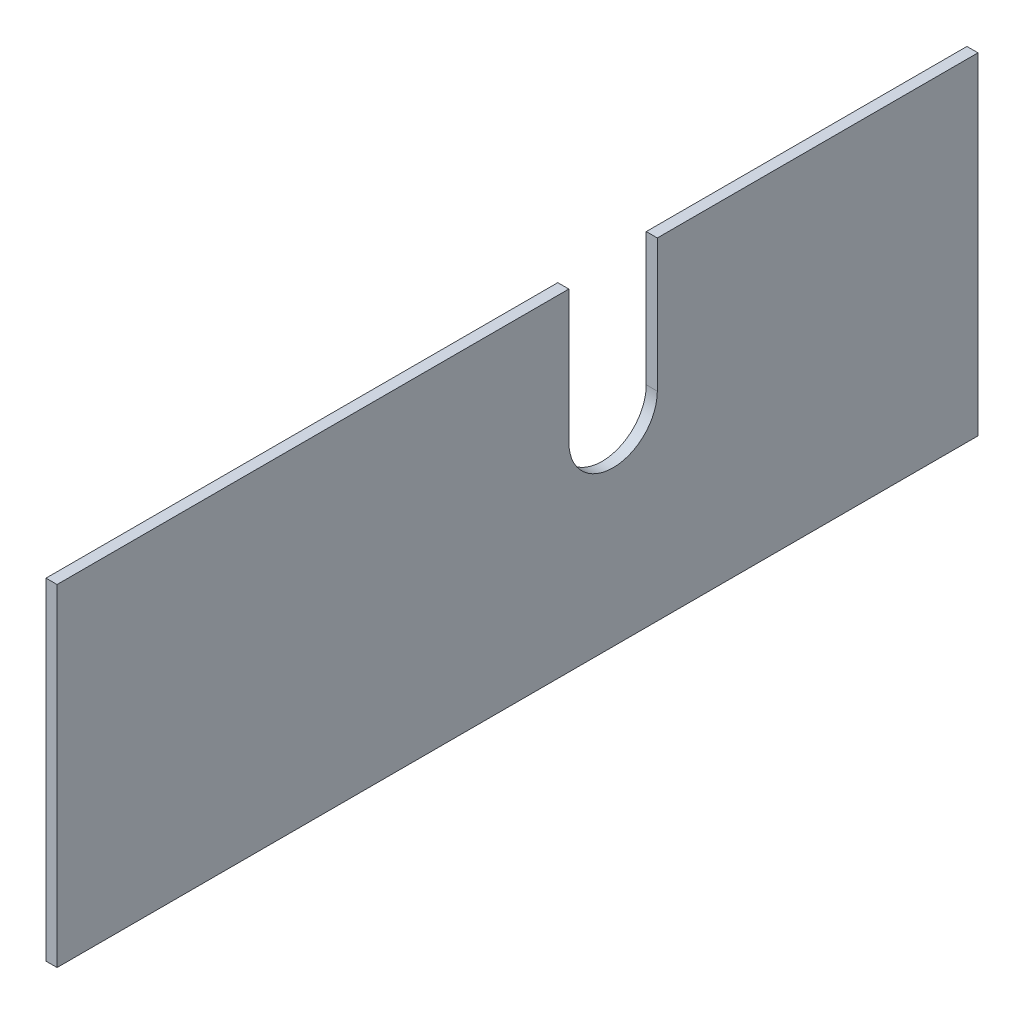
ISO-10303-21;
HEADER;
FILE_DESCRIPTION(('STEP AP214'),'2;1');
FILE_NAME('part.step','',(''),(''),'','','');
FILE_SCHEMA(('AUTOMOTIVE_DESIGN { 1 0 10303 214 1 1 1 1 }'));
ENDSEC;
DATA;
#1=APPLICATION_CONTEXT('core data for automotive mechanical design processes');
#2=APPLICATION_PROTOCOL_DEFINITION('international standard','automotive_design',2000,#1);
#3=PRODUCT_CONTEXT('',#1,'mechanical');
#4=PRODUCT('Part','Part','',(#3));
#5=PRODUCT_RELATED_PRODUCT_CATEGORY('part','',(#4));
#6=PRODUCT_DEFINITION_FORMATION('','',#4);
#7=PRODUCT_DEFINITION_CONTEXT('part definition',#1,'design');
#8=PRODUCT_DEFINITION('design','',#6,#7);
#9=PRODUCT_DEFINITION_SHAPE('','',#8);
#10=(LENGTH_UNIT() NAMED_UNIT(*) SI_UNIT(.MILLI.,.METRE.));
#11=(NAMED_UNIT(*) PLANE_ANGLE_UNIT() SI_UNIT($,.RADIAN.));
#12=(NAMED_UNIT(*) SI_UNIT($,.STERADIAN.) SOLID_ANGLE_UNIT());
#13=UNCERTAINTY_MEASURE_WITH_UNIT(LENGTH_MEASURE(1.E-05),#10,'distance_accuracy_value','');
#14=(GEOMETRIC_REPRESENTATION_CONTEXT(3) GLOBAL_UNCERTAINTY_ASSIGNED_CONTEXT((#13)) GLOBAL_UNIT_ASSIGNED_CONTEXT((#10,
#11,#12)) REPRESENTATION_CONTEXT('',''));
#15=CARTESIAN_POINT('',(0.,0.,0.));
#16=DIRECTION('',(0.,0.,1.));
#17=DIRECTION('',(1.,0.,0.));
#18=AXIS2_PLACEMENT_3D('',#15,#16,#17);
#19=CARTESIAN_POINT('',(1.,15.,41.64));
#20=DIRECTION('',(0.,-1.,0.));
#21=DIRECTION('',(0.,0.,-1.));
#22=AXIS2_PLACEMENT_3D('',#19,#20,#21);
#23=PLANE('',#22);
#24=DIRECTION('',(1.,0.,0.));
#25=VECTOR('',#24,1.);
#26=CARTESIAN_POINT('',(0.,15.,-4.63999999999999));
#27=LINE('',#26,#25);
#28=CARTESIAN_POINT('',(0.,15.,-4.63999999999999));
#29=VERTEX_POINT('',#28);
#30=CARTESIAN_POINT('',(1.,15.,-4.63999999999999));
#31=VERTEX_POINT('',#30);
#32=EDGE_CURVE('E140',#29,#31,#27,.T.);
#33=ORIENTED_EDGE('',*,*,#32,.F.);
#34=DIRECTION('',(0.,0.,1.));
#35=VECTOR('',#34,1.);
#36=CARTESIAN_POINT('',(0.,15.,41.64));
#37=LINE('',#36,#35);
#38=CARTESIAN_POINT('',(0.,15.,41.64));
#39=VERTEX_POINT('',#38);
#40=EDGE_CURVE('E131',#29,#39,#37,.T.);
#41=ORIENTED_EDGE('',*,*,#40,.T.);
#42=DIRECTION('',(-1.,0.,0.));
#43=VECTOR('',#42,1.);
#44=CARTESIAN_POINT('',(1.,15.,41.64));
#45=LINE('',#44,#43);
#46=CARTESIAN_POINT('',(1.,15.,41.64));
#47=VERTEX_POINT('',#46);
#48=EDGE_CURVE('E44',#47,#39,#45,.T.);
#49=ORIENTED_EDGE('',*,*,#48,.F.);
#50=DIRECTION('',(0.,0.,1.));
#51=VECTOR('',#50,1.);
#52=CARTESIAN_POINT('',(1.,15.,41.64));
#53=LINE('',#52,#51);
#54=EDGE_CURVE('E148',#31,#47,#53,.T.);
#55=ORIENTED_EDGE('',*,*,#54,.F.);
#56=EDGE_LOOP('',(#33,#41,#49,#55));
#57=FACE_BOUND('',#56,.T.);
#58=ADVANCED_FACE('F36',(#57),#23,.F.);
#59=CARTESIAN_POINT('',(1.,0.,0.));
#60=DIRECTION('',(-1.,0.,0.));
#61=DIRECTION('',(0.,0.,1.));
#62=AXIS2_PLACEMENT_3D('',#59,#60,#61);
#63=PLANE('',#62);
#64=DIRECTION('',(0.,1.,0.));
#65=VECTOR('',#64,1.);
#66=CARTESIAN_POINT('',(1.,0.,-4.63999999999999));
#67=LINE('',#66,#65);
#68=CARTESIAN_POINT('',(1.,2.99999999999999,-4.63999999999999));
#69=VERTEX_POINT('',#68);
#70=EDGE_CURVE('E117',#69,#31,#67,.T.);
#71=ORIENTED_EDGE('',*,*,#70,.T.);
#72=ORIENTED_EDGE('',*,*,#54,.T.);
#73=DIRECTION('',(0.,-1.,0.));
#74=VECTOR('',#73,1.);
#75=CARTESIAN_POINT('',(1.,-15.,41.64));
#76=LINE('',#75,#74);
#77=CARTESIAN_POINT('',(1.,-15.,41.64));
#78=VERTEX_POINT('',#77);
#79=EDGE_CURVE('E150',#47,#78,#76,.T.);
#80=ORIENTED_EDGE('',*,*,#79,.T.);
#81=DIRECTION('',(0.,0.,-1.));
#82=VECTOR('',#81,1.);
#83=CARTESIAN_POINT('',(1.,-15.,41.64));
#84=LINE('',#83,#82);
#85=CARTESIAN_POINT('',(1.,-15.,-41.64));
#86=VERTEX_POINT('',#85);
#87=EDGE_CURVE('E60',#78,#86,#84,.T.);
#88=ORIENTED_EDGE('',*,*,#87,.T.);
#89=DIRECTION('',(0.,1.,0.));
#90=VECTOR('',#89,1.);
#91=CARTESIAN_POINT('',(1.,-15.,-41.64));
#92=LINE('',#91,#90);
#93=CARTESIAN_POINT('',(1.,15.,-41.64));
#94=VERTEX_POINT('',#93);
#95=EDGE_CURVE('E146',#86,#94,#92,.T.);
#96=ORIENTED_EDGE('',*,*,#95,.T.);
#97=CARTESIAN_POINT('',(1.,15.,-12.64));
#98=VERTEX_POINT('',#97);
#99=EDGE_CURVE('E88',#94,#98,#53,.T.);
#100=ORIENTED_EDGE('',*,*,#99,.T.);
#101=DIRECTION('',(0.,1.,0.));
#102=VECTOR('',#101,1.);
#103=CARTESIAN_POINT('',(1.,0.,-12.64));
#104=LINE('',#103,#102);
#105=CARTESIAN_POINT('',(1.,2.99999999999999,-12.64));
#106=VERTEX_POINT('',#105);
#107=EDGE_CURVE('E132',#106,#98,#104,.T.);
#108=ORIENTED_EDGE('',*,*,#107,.F.);
#109=CARTESIAN_POINT('',(1.,2.99999999999999,-8.64));
#110=DIRECTION('',(1.,0.,0.));
#111=DIRECTION('',(0.,0.,-1.));
#112=AXIS2_PLACEMENT_3D('',#109,#110,#111);
#113=CIRCLE('',#112,4.);
#114=EDGE_CURVE('E134',#69,#106,#113,.T.);
#115=ORIENTED_EDGE('',*,*,#114,.F.);
#116=EDGE_LOOP('',(#71,#72,#80,#88,#96,#100,#108,#115));
#117=FACE_BOUND('',#116,.T.);
#118=ADVANCED_FACE('F190',(#117),#63,.F.);
#119=CARTESIAN_POINT('',(0.,0.,0.));
#120=DIRECTION('',(-1.,0.,0.));
#121=DIRECTION('',(0.,0.,1.));
#122=AXIS2_PLACEMENT_3D('',#119,#120,#121);
#123=PLANE('',#122);
#124=ORIENTED_EDGE('',*,*,#40,.F.);
#125=DIRECTION('',(0.,1.,0.));
#126=VECTOR('',#125,1.);
#127=CARTESIAN_POINT('',(0.,0.,-4.63999999999999));
#128=LINE('',#127,#126);
#129=CARTESIAN_POINT('',(0.,2.99999999999999,-4.63999999999999));
#130=VERTEX_POINT('',#129);
#131=EDGE_CURVE('E114',#130,#29,#128,.T.);
#132=ORIENTED_EDGE('',*,*,#131,.F.);
#133=CARTESIAN_POINT('',(0.,2.99999999999999,-8.64));
#134=DIRECTION('',(1.,0.,0.));
#135=DIRECTION('',(0.,0.,-1.));
#136=AXIS2_PLACEMENT_3D('',#133,#134,#135);
#137=CIRCLE('',#136,4.);
#138=CARTESIAN_POINT('',(0.,2.99999999999999,-12.64));
#139=VERTEX_POINT('',#138);
#140=EDGE_CURVE('E124',#130,#139,#137,.T.);
#141=ORIENTED_EDGE('',*,*,#140,.T.);
#142=DIRECTION('',(0.,1.,0.));
#143=VECTOR('',#142,1.);
#144=CARTESIAN_POINT('',(0.,0.,-12.64));
#145=LINE('',#144,#143);
#146=CARTESIAN_POINT('',(0.,15.,-12.64));
#147=VERTEX_POINT('',#146);
#148=EDGE_CURVE('E51',#139,#147,#145,.T.);
#149=ORIENTED_EDGE('',*,*,#148,.T.);
#150=CARTESIAN_POINT('',(0.,15.,-41.64));
#151=VERTEX_POINT('',#150);
#152=EDGE_CURVE('E156',#151,#147,#37,.T.);
#153=ORIENTED_EDGE('',*,*,#152,.F.);
#154=DIRECTION('',(0.,1.,0.));
#155=VECTOR('',#154,1.);
#156=CARTESIAN_POINT('',(0.,-15.,-41.64));
#157=LINE('',#156,#155);
#158=CARTESIAN_POINT('',(0.,-15.,-41.64));
#159=VERTEX_POINT('',#158);
#160=EDGE_CURVE('E142',#159,#151,#157,.T.);
#161=ORIENTED_EDGE('',*,*,#160,.F.);
#162=DIRECTION('',(0.,0.,-1.));
#163=VECTOR('',#162,1.);
#164=CARTESIAN_POINT('',(0.,-15.,41.64));
#165=LINE('',#164,#163);
#166=CARTESIAN_POINT('',(0.,-15.,41.64));
#167=VERTEX_POINT('',#166);
#168=EDGE_CURVE('E81',#167,#159,#165,.T.);
#169=ORIENTED_EDGE('',*,*,#168,.F.);
#170=DIRECTION('',(0.,-1.,0.));
#171=VECTOR('',#170,1.);
#172=CARTESIAN_POINT('',(0.,-15.,41.64));
#173=LINE('',#172,#171);
#174=EDGE_CURVE('E159',#39,#167,#173,.T.);
#175=ORIENTED_EDGE('',*,*,#174,.F.);
#176=EDGE_LOOP('',(#124,#132,#141,#149,#153,#161,#169,#175));
#177=FACE_BOUND('',#176,.T.);
#178=ADVANCED_FACE('F129',(#177),#123,.T.);
#179=CARTESIAN_POINT('',(1.,-15.,-41.64));
#180=DIRECTION('',(0.,0.,1.));
#181=DIRECTION('',(1.,0.,0.));
#182=AXIS2_PLACEMENT_3D('',#179,#180,#181);
#183=PLANE('',#182);
#184=ORIENTED_EDGE('',*,*,#160,.T.);
#185=DIRECTION('',(-1.,0.,0.));
#186=VECTOR('',#185,1.);
#187=CARTESIAN_POINT('',(1.,15.,-41.64));
#188=LINE('',#187,#186);
#189=EDGE_CURVE('E11',#94,#151,#188,.T.);
#190=ORIENTED_EDGE('',*,*,#189,.F.);
#191=ORIENTED_EDGE('',*,*,#95,.F.);
#192=DIRECTION('',(-1.,0.,0.));
#193=VECTOR('',#192,1.);
#194=CARTESIAN_POINT('',(1.,-15.,-41.64));
#195=LINE('',#194,#193);
#196=EDGE_CURVE('E153',#86,#159,#195,.T.);
#197=ORIENTED_EDGE('',*,*,#196,.T.);
#198=EDGE_LOOP('',(#184,#190,#191,#197));
#199=FACE_BOUND('',#198,.T.);
#200=ADVANCED_FACE('F38',(#199),#183,.F.);
#201=ORIENTED_EDGE('',*,*,#152,.T.);
#202=DIRECTION('',(1.,0.,0.));
#203=VECTOR('',#202,1.);
#204=CARTESIAN_POINT('',(0.,15.,-12.64));
#205=LINE('',#204,#203);
#206=EDGE_CURVE('E143',#147,#98,#205,.T.);
#207=ORIENTED_EDGE('',*,*,#206,.T.);
#208=ORIENTED_EDGE('',*,*,#99,.F.);
#209=ORIENTED_EDGE('',*,*,#189,.T.);
#210=EDGE_LOOP('',(#201,#207,#208,#209));
#211=FACE_BOUND('',#210,.T.);
#212=ADVANCED_FACE('F186',(#211),#23,.F.);
#213=CARTESIAN_POINT('',(1.,-15.,41.64));
#214=DIRECTION('',(0.,0.,-1.));
#215=DIRECTION('',(-1.,0.,0.));
#216=AXIS2_PLACEMENT_3D('',#213,#214,#215);
#217=PLANE('',#216);
#218=ORIENTED_EDGE('',*,*,#174,.T.);
#219=DIRECTION('',(-1.,0.,0.));
#220=VECTOR('',#219,1.);
#221=CARTESIAN_POINT('',(1.,-15.,41.64));
#222=LINE('',#221,#220);
#223=EDGE_CURVE('E163',#78,#167,#222,.T.);
#224=ORIENTED_EDGE('',*,*,#223,.F.);
#225=ORIENTED_EDGE('',*,*,#79,.F.);
#226=ORIENTED_EDGE('',*,*,#48,.T.);
#227=EDGE_LOOP('',(#218,#224,#225,#226));
#228=FACE_BOUND('',#227,.T.);
#229=ADVANCED_FACE('F168',(#228),#217,.F.);
#230=CARTESIAN_POINT('',(1.,-15.,41.64));
#231=DIRECTION('',(0.,1.,0.));
#232=DIRECTION('',(0.,0.,1.));
#233=AXIS2_PLACEMENT_3D('',#230,#231,#232);
#234=PLANE('',#233);
#235=ORIENTED_EDGE('',*,*,#168,.T.);
#236=ORIENTED_EDGE('',*,*,#196,.F.);
#237=ORIENTED_EDGE('',*,*,#87,.F.);
#238=ORIENTED_EDGE('',*,*,#223,.T.);
#239=EDGE_LOOP('',(#235,#236,#237,#238));
#240=FACE_BOUND('',#239,.T.);
#241=ADVANCED_FACE('F176',(#240),#234,.F.);
#242=CARTESIAN_POINT('',(0.,0.,-4.63999999999999));
#243=DIRECTION('',(0.,0.,-1.));
#244=DIRECTION('',(-1.,0.,0.));
#245=AXIS2_PLACEMENT_3D('',#242,#243,#244);
#246=PLANE('',#245);
#247=ORIENTED_EDGE('',*,*,#70,.F.);
#248=DIRECTION('',(1.,0.,0.));
#249=VECTOR('',#248,1.);
#250=CARTESIAN_POINT('',(0.,2.99999999999999,-4.63999999999999));
#251=LINE('',#250,#249);
#252=EDGE_CURVE('E110',#130,#69,#251,.T.);
#253=ORIENTED_EDGE('',*,*,#252,.F.);
#254=ORIENTED_EDGE('',*,*,#131,.T.);
#255=ORIENTED_EDGE('',*,*,#32,.T.);
#256=EDGE_LOOP('',(#247,#253,#254,#255));
#257=FACE_BOUND('',#256,.T.);
#258=ADVANCED_FACE('F112',(#257),#246,.T.);
#259=CARTESIAN_POINT('',(0.,0.,-12.64));
#260=DIRECTION('',(0.,0.,-1.));
#261=DIRECTION('',(-1.,0.,0.));
#262=AXIS2_PLACEMENT_3D('',#259,#260,#261);
#263=PLANE('',#262);
#264=ORIENTED_EDGE('',*,*,#107,.T.);
#265=ORIENTED_EDGE('',*,*,#206,.F.);
#266=ORIENTED_EDGE('',*,*,#148,.F.);
#267=DIRECTION('',(1.,0.,0.));
#268=VECTOR('',#267,1.);
#269=CARTESIAN_POINT('',(0.,2.99999999999999,-12.64));
#270=LINE('',#269,#268);
#271=EDGE_CURVE('E121',#139,#106,#270,.T.);
#272=ORIENTED_EDGE('',*,*,#271,.T.);
#273=EDGE_LOOP('',(#264,#265,#266,#272));
#274=FACE_BOUND('',#273,.T.);
#275=ADVANCED_FACE('F184',(#274),#263,.F.);
#276=CARTESIAN_POINT('',(0.,2.99999999999999,-8.64));
#277=DIRECTION('',(1.,0.,0.));
#278=DIRECTION('',(0.,0.,-1.));
#279=AXIS2_PLACEMENT_3D('',#276,#277,#278);
#280=CYLINDRICAL_SURFACE('',#279,4.);
#281=ORIENTED_EDGE('',*,*,#114,.T.);
#282=ORIENTED_EDGE('',*,*,#271,.F.);
#283=ORIENTED_EDGE('',*,*,#140,.F.);
#284=ORIENTED_EDGE('',*,*,#252,.T.);
#285=EDGE_LOOP('',(#281,#282,#283,#284));
#286=FACE_BOUND('',#285,.T.);
#287=ADVANCED_FACE('F125',(#286),#280,.F.);
#288=CLOSED_SHELL('',(#58,#118,#178,#200,#212,#229,#241,#258,#275,#287));
#289=MANIFOLD_SOLID_BREP('B2',#288);
#290=ADVANCED_BREP_SHAPE_REPRESENTATION('',(#18,#289),#14);
#291=SHAPE_DEFINITION_REPRESENTATION(#9,#290);
ENDSEC;
END-ISO-10303-21;
